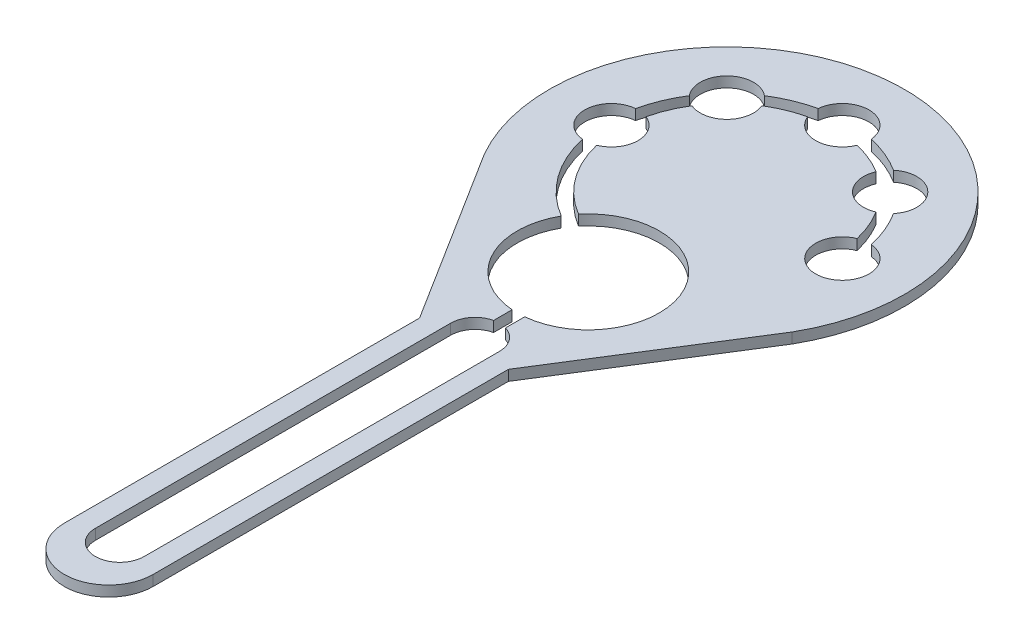
ISO-10303-21;
HEADER;
FILE_DESCRIPTION(('STEP AP214'),'2;1');
FILE_NAME('part.step','',(''),(''),'','','');
FILE_SCHEMA(('AUTOMOTIVE_DESIGN { 1 0 10303 214 1 1 1 1 }'));
ENDSEC;
DATA;
#1=APPLICATION_CONTEXT('core data for automotive mechanical design processes');
#2=APPLICATION_PROTOCOL_DEFINITION('international standard','automotive_design',2000,#1);
#3=PRODUCT_CONTEXT('',#1,'mechanical');
#4=PRODUCT('Part','Part','',(#3));
#5=PRODUCT_RELATED_PRODUCT_CATEGORY('part','',(#4));
#6=PRODUCT_DEFINITION_FORMATION('','',#4);
#7=PRODUCT_DEFINITION_CONTEXT('part definition',#1,'design');
#8=PRODUCT_DEFINITION('design','',#6,#7);
#9=PRODUCT_DEFINITION_SHAPE('','',#8);
#10=(LENGTH_UNIT() NAMED_UNIT(*) SI_UNIT(.MILLI.,.METRE.));
#11=(NAMED_UNIT(*) PLANE_ANGLE_UNIT() SI_UNIT($,.RADIAN.));
#12=(NAMED_UNIT(*) SI_UNIT($,.STERADIAN.) SOLID_ANGLE_UNIT());
#13=UNCERTAINTY_MEASURE_WITH_UNIT(LENGTH_MEASURE(1.E-05),#10,'distance_accuracy_value','');
#14=(GEOMETRIC_REPRESENTATION_CONTEXT(3) GLOBAL_UNCERTAINTY_ASSIGNED_CONTEXT((#13)) GLOBAL_UNIT_ASSIGNED_CONTEXT((#10,
#11,#12)) REPRESENTATION_CONTEXT('',''));
#15=CARTESIAN_POINT('',(0.,0.,0.));
#16=DIRECTION('',(0.,0.,1.));
#17=DIRECTION('',(1.,0.,0.));
#18=AXIS2_PLACEMENT_3D('',#15,#16,#17);
#19=CARTESIAN_POINT('',(0.,0.,39.624));
#20=DIRECTION('',(0.,1.,0.));
#21=DIRECTION('',(0.,0.,1.));
#22=AXIS2_PLACEMENT_3D('',#19,#20,#21);
#23=CYLINDRICAL_SURFACE('',#22,20.32);
#24=CARTESIAN_POINT('',(0.,0.,39.624));
#25=DIRECTION('',(0.,1.,0.));
#26=DIRECTION('',(0.,0.,1.));
#27=AXIS2_PLACEMENT_3D('',#24,#25,#26);
#28=CIRCLE('',#27,20.32);
#29=CARTESIAN_POINT('',(2.03200000000018,0.,59.8421447220065));
#30=VERTEX_POINT('',#29);
#31=CARTESIAN_POINT('',(-15.6958403472736,0.,26.7188461538462));
#32=VERTEX_POINT('',#31);
#33=EDGE_CURVE('E303',#30,#32,#28,.T.);
#34=ORIENTED_EDGE('',*,*,#33,.F.);
#35=DIRECTION('',(0.,1.,0.));
#36=VECTOR('',#35,1.);
#37=CARTESIAN_POINT('',(2.03200000000018,0.,59.8421447220065));
#38=LINE('',#37,#36);
#39=CARTESIAN_POINT('',(2.03200000000018,2.9972,59.8421447220065));
#40=VERTEX_POINT('',#39);
#41=EDGE_CURVE('E281',#30,#40,#38,.T.);
#42=ORIENTED_EDGE('',*,*,#41,.T.);
#43=CARTESIAN_POINT('',(0.,2.9972,39.624));
#44=DIRECTION('',(0.,1.,0.));
#45=DIRECTION('',(0.,0.,1.));
#46=AXIS2_PLACEMENT_3D('',#43,#44,#45);
#47=CIRCLE('',#46,20.32);
#48=CARTESIAN_POINT('',(-15.6958403472736,2.9972,26.7188461538462));
#49=VERTEX_POINT('',#48);
#50=EDGE_CURVE('E270',#40,#49,#47,.T.);
#51=ORIENTED_EDGE('',*,*,#50,.T.);
#52=DIRECTION('',(0.,1.,0.));
#53=VECTOR('',#52,1.);
#54=CARTESIAN_POINT('',(-15.6958403472736,1.4986,26.7188461538462));
#55=LINE('',#54,#53);
#56=EDGE_CURVE('E465',#32,#49,#55,.T.);
#57=ORIENTED_EDGE('',*,*,#56,.F.);
#58=EDGE_LOOP('',(#34,#42,#51,#57));
#59=FACE_BOUND('',#58,.T.);
#60=ADVANCED_FACE('F37',(#59),#23,.F.);
#61=CARTESIAN_POINT('',(0.,0.,72.009));
#62=DIRECTION('',(0.,1.,0.));
#63=DIRECTION('',(0.,0.,1.));
#64=AXIS2_PLACEMENT_3D('',#61,#62,#63);
#65=CYLINDRICAL_SURFACE('',#64,6.985);
#66=CARTESIAN_POINT('',(0.,2.9972,72.009));
#67=DIRECTION('',(0.,1.,0.));
#68=DIRECTION('',(0.,0.,1.));
#69=AXIS2_PLACEMENT_3D('',#66,#67,#68);
#70=CIRCLE('',#69,6.985);
#71=CARTESIAN_POINT('',(6.985,2.9972,72.009));
#72=VERTEX_POINT('',#71);
#73=CARTESIAN_POINT('',(2.03200000000019,2.9972,65.3260963646032));
#74=VERTEX_POINT('',#73);
#75=EDGE_CURVE('E268',#72,#74,#70,.T.);
#76=ORIENTED_EDGE('',*,*,#75,.T.);
#77=DIRECTION('',(0.,1.,0.));
#78=VECTOR('',#77,1.);
#79=CARTESIAN_POINT('',(2.03200000000018,0.,65.3260963646032));
#80=LINE('',#79,#78);
#81=CARTESIAN_POINT('',(2.03200000000018,0.,65.3260963646032));
#82=VERTEX_POINT('',#81);
#83=EDGE_CURVE('E11',#74,#82,#80,.F.);
#84=ORIENTED_EDGE('',*,*,#83,.T.);
#85=CARTESIAN_POINT('',(0.,0.,72.009));
#86=DIRECTION('',(0.,1.,0.));
#87=DIRECTION('',(0.,0.,1.));
#88=AXIS2_PLACEMENT_3D('',#85,#86,#87);
#89=CIRCLE('',#88,6.985);
#90=CARTESIAN_POINT('',(6.985,0.,72.009));
#91=VERTEX_POINT('',#90);
#92=EDGE_CURVE('E485',#91,#82,#89,.T.);
#93=ORIENTED_EDGE('',*,*,#92,.F.);
#94=DIRECTION('',(0.,1.,0.));
#95=VECTOR('',#94,1.);
#96=CARTESIAN_POINT('',(6.985,0.,72.009));
#97=LINE('',#96,#95);
#98=EDGE_CURVE('E273',#91,#72,#97,.T.);
#99=ORIENTED_EDGE('',*,*,#98,.T.);
#100=EDGE_LOOP('',(#76,#84,#93,#99));
#101=FACE_BOUND('',#100,.T.);
#102=ADVANCED_FACE('F272',(#101),#65,.F.);
#103=CARTESIAN_POINT('',(-33.02,0.,0.));
#104=DIRECTION('',(0.,1.,0.));
#105=DIRECTION('',(0.,0.,1.));
#106=AXIS2_PLACEMENT_3D('',#103,#104,#105);
#107=CYLINDRICAL_SURFACE('',#106,7.62);
#108=CARTESIAN_POINT('',(-33.02,0.,0.));
#109=DIRECTION('',(0.,1.,0.));
#110=DIRECTION('',(0.,0.,1.));
#111=AXIS2_PLACEMENT_3D('',#108,#109,#110);
#112=CIRCLE('',#111,7.62);
#113=CARTESIAN_POINT('',(-33.6999384615385,0.,-7.58960365819722));
#114=VERTEX_POINT('',#113);
#115=CARTESIAN_POINT('',(-33.6999384615385,0.,7.58960365819722));
#116=VERTEX_POINT('',#115);
#117=EDGE_CURVE('E403',#114,#116,#112,.T.);
#118=ORIENTED_EDGE('',*,*,#117,.F.);
#119=DIRECTION('',(0.,1.,0.));
#120=VECTOR('',#119,1.);
#121=CARTESIAN_POINT('',(-33.6999384615385,1.4986,-7.58960365819723));
#122=LINE('',#121,#120);
#123=CARTESIAN_POINT('',(-33.6999384615385,2.9972,-7.58960365819722));
#124=VERTEX_POINT('',#123);
#125=EDGE_CURVE('E366',#114,#124,#122,.T.);
#126=ORIENTED_EDGE('',*,*,#125,.T.);
#127=CARTESIAN_POINT('',(-33.02,2.9972,0.));
#128=DIRECTION('',(0.,1.,0.));
#129=DIRECTION('',(0.,0.,1.));
#130=AXIS2_PLACEMENT_3D('',#127,#128,#129);
#131=CIRCLE('',#130,7.62);
#132=CARTESIAN_POINT('',(-33.6999384615385,2.9972,7.58960365819722));
#133=VERTEX_POINT('',#132);
#134=EDGE_CURVE('E407',#124,#133,#131,.T.);
#135=ORIENTED_EDGE('',*,*,#134,.T.);
#136=DIRECTION('',(0.,1.,0.));
#137=VECTOR('',#136,1.);
#138=CARTESIAN_POINT('',(-33.6999384615385,1.4986,7.58960365819723));
#139=LINE('',#138,#137);
#140=EDGE_CURVE('E363',#133,#116,#139,.F.);
#141=ORIENTED_EDGE('',*,*,#140,.T.);
#142=EDGE_LOOP('',(#118,#126,#135,#141));
#143=FACE_BOUND('',#142,.T.);
#144=ADVANCED_FACE('F542',(#143),#107,.F.);
#145=CARTESIAN_POINT('',(23.3486659147799,0.,-23.3486659147797));
#146=DIRECTION('',(0.,1.,0.));
#147=DIRECTION('',(0.,0.,1.));
#148=AXIS2_PLACEMENT_3D('',#145,#146,#147);
#149=CYLINDRICAL_SURFACE('',#148,7.62);
#150=CARTESIAN_POINT('',(23.3486659147799,0.,-23.3486659147797));
#151=DIRECTION('',(0.,1.,0.));
#152=DIRECTION('',(0.,0.,1.));
#153=AXIS2_PLACEMENT_3D('',#150,#151,#152);
#154=CIRCLE('',#153,7.62);
#155=CARTESIAN_POINT('',(29.1961152249528,0.,-18.4627947984936));
#156=VERTEX_POINT('',#155);
#157=CARTESIAN_POINT('',(18.4627947984939,0.,-29.1961152249526));
#158=VERTEX_POINT('',#157);
#159=EDGE_CURVE('E386',#156,#158,#154,.T.);
#160=ORIENTED_EDGE('',*,*,#159,.F.);
#161=DIRECTION('',(0.,1.,0.));
#162=VECTOR('',#161,1.);
#163=CARTESIAN_POINT('',(29.1961152249528,1.4986,-18.4627947984936));
#164=LINE('',#163,#162);
#165=CARTESIAN_POINT('',(29.1961152249528,2.9972,-18.4627947984936));
#166=VERTEX_POINT('',#165);
#167=EDGE_CURVE('E357',#156,#166,#164,.T.);
#168=ORIENTED_EDGE('',*,*,#167,.T.);
#169=CARTESIAN_POINT('',(23.3486659147799,2.9972,-23.3486659147797));
#170=DIRECTION('',(0.,1.,0.));
#171=DIRECTION('',(0.,0.,1.));
#172=AXIS2_PLACEMENT_3D('',#169,#170,#171);
#173=CIRCLE('',#172,7.62);
#174=CARTESIAN_POINT('',(18.4627947984939,2.9972,-29.1961152249526));
#175=VERTEX_POINT('',#174);
#176=EDGE_CURVE('E390',#166,#175,#173,.T.);
#177=ORIENTED_EDGE('',*,*,#176,.T.);
#178=DIRECTION('',(0.,1.,0.));
#179=VECTOR('',#178,1.);
#180=CARTESIAN_POINT('',(18.4627947984939,1.4986,-29.1961152249526));
#181=LINE('',#180,#179);
#182=EDGE_CURVE('E354',#175,#158,#181,.F.);
#183=ORIENTED_EDGE('',*,*,#182,.T.);
#184=EDGE_LOOP('',(#160,#168,#177,#183));
#185=FACE_BOUND('',#184,.T.);
#186=ADVANCED_FACE('F585',(#185),#149,.F.);
#187=CARTESIAN_POINT('',(1.152887138086E-13,0.,-33.02));
#188=DIRECTION('',(0.,1.,0.));
#189=DIRECTION('',(0.,0.,1.));
#190=AXIS2_PLACEMENT_3D('',#187,#188,#189);
#191=CYLINDRICAL_SURFACE('',#190,7.62);
#192=CARTESIAN_POINT('',(1.152887138086E-13,0.,-33.02));
#193=DIRECTION('',(0.,1.,0.));
#194=DIRECTION('',(0.,0.,1.));
#195=AXIS2_PLACEMENT_3D('',#192,#193,#194);
#196=CIRCLE('',#195,7.62);
#197=CARTESIAN_POINT('',(7.58960365819734,0.,-33.6999384615384));
#198=VERTEX_POINT('',#197);
#199=CARTESIAN_POINT('',(-7.5896036581971,0.,-33.6999384615385));
#200=VERTEX_POINT('',#199);
#201=EDGE_CURVE('E378',#198,#200,#196,.T.);
#202=ORIENTED_EDGE('',*,*,#201,.F.);
#203=DIRECTION('',(0.,1.,0.));
#204=VECTOR('',#203,1.);
#205=CARTESIAN_POINT('',(7.58960365819734,1.4986,-33.6999384615384));
#206=LINE('',#205,#204);
#207=CARTESIAN_POINT('',(7.58960365819734,2.9972,-33.6999384615384));
#208=VERTEX_POINT('',#207);
#209=EDGE_CURVE('E351',#198,#208,#206,.T.);
#210=ORIENTED_EDGE('',*,*,#209,.T.);
#211=CARTESIAN_POINT('',(1.152887138086E-13,2.9972,-33.02));
#212=DIRECTION('',(0.,1.,0.));
#213=DIRECTION('',(0.,0.,1.));
#214=AXIS2_PLACEMENT_3D('',#211,#212,#213);
#215=CIRCLE('',#214,7.62);
#216=CARTESIAN_POINT('',(-7.5896036581971,2.9972,-33.6999384615385));
#217=VERTEX_POINT('',#216);
#218=EDGE_CURVE('E382',#208,#217,#215,.T.);
#219=ORIENTED_EDGE('',*,*,#218,.T.);
#220=DIRECTION('',(0.,1.,0.));
#221=VECTOR('',#220,1.);
#222=CARTESIAN_POINT('',(-7.58960365819711,1.4986,-33.6999384615385));
#223=LINE('',#222,#221);
#224=EDGE_CURVE('E348',#217,#200,#223,.F.);
#225=ORIENTED_EDGE('',*,*,#224,.T.);
#226=EDGE_LOOP('',(#202,#210,#219,#225));
#227=FACE_BOUND('',#226,.T.);
#228=ADVANCED_FACE('F556',(#227),#191,.F.);
#229=CARTESIAN_POINT('',(-23.3486659147798,0.,-23.3486659147798));
#230=DIRECTION('',(0.,1.,0.));
#231=DIRECTION('',(0.,0.,1.));
#232=AXIS2_PLACEMENT_3D('',#229,#230,#231);
#233=CYLINDRICAL_SURFACE('',#232,7.62);
#234=CARTESIAN_POINT('',(-23.3486659147798,0.,-23.3486659147798));
#235=DIRECTION('',(0.,1.,0.));
#236=DIRECTION('',(0.,0.,1.));
#237=AXIS2_PLACEMENT_3D('',#234,#235,#236);
#238=CIRCLE('',#237,7.62);
#239=CARTESIAN_POINT('',(-18.4627947984937,0.,-29.1961152249527));
#240=VERTEX_POINT('',#239);
#241=CARTESIAN_POINT('',(-29.1961152249526,0.,-18.4627947984938));
#242=VERTEX_POINT('',#241);
#243=EDGE_CURVE('E373',#240,#242,#238,.T.);
#244=ORIENTED_EDGE('',*,*,#243,.F.);
#245=DIRECTION('',(0.,1.,0.));
#246=VECTOR('',#245,1.);
#247=CARTESIAN_POINT('',(-18.4627947984937,1.4986,-29.1961152249527));
#248=LINE('',#247,#246);
#249=CARTESIAN_POINT('',(-18.4627947984937,2.9972,-29.1961152249527));
#250=VERTEX_POINT('',#249);
#251=EDGE_CURVE('E462',#240,#250,#248,.T.);
#252=ORIENTED_EDGE('',*,*,#251,.T.);
#253=CARTESIAN_POINT('',(-23.3486659147798,2.9972,-23.3486659147798));
#254=DIRECTION('',(0.,1.,0.));
#255=DIRECTION('',(0.,0.,1.));
#256=AXIS2_PLACEMENT_3D('',#253,#254,#255);
#257=CIRCLE('',#256,7.62);
#258=CARTESIAN_POINT('',(-29.1961152249526,2.9972,-18.4627947984938));
#259=VERTEX_POINT('',#258);
#260=EDGE_CURVE('E374',#250,#259,#257,.T.);
#261=ORIENTED_EDGE('',*,*,#260,.T.);
#262=DIRECTION('',(0.,1.,0.));
#263=VECTOR('',#262,1.);
#264=CARTESIAN_POINT('',(-29.1961152249526,1.4986,-18.4627947984938));
#265=LINE('',#264,#263);
#266=EDGE_CURVE('E459',#259,#242,#265,.F.);
#267=ORIENTED_EDGE('',*,*,#266,.T.);
#268=EDGE_LOOP('',(#244,#252,#261,#267));
#269=FACE_BOUND('',#268,.T.);
#270=ADVANCED_FACE('F551',(#269),#233,.F.);
#271=CARTESIAN_POINT('',(-42.9773748278259,2.9972,27.0129462983711));
#272=DIRECTION('',(0.84664900712744,0.,-0.532151725290936));
#273=DIRECTION('',(-0.532151725290936,0.,-0.84664900712744));
#274=AXIS2_PLACEMENT_3D('',#271,#272,#273);
#275=PLANE('',#274);
#276=DIRECTION('',(0.532151725290936,0.,0.84664900712744));
#277=VECTOR('',#276,1.);
#278=CARTESIAN_POINT('',(-42.9773748278259,0.,27.0129462983711));
#279=LINE('',#278,#277);
#280=CARTESIAN_POINT('',(-44.0264003273322,0.,25.3439553783045));
#281=VERTEX_POINT('',#280);
#282=CARTESIAN_POINT('',(-12.7,0.,75.184));
#283=VERTEX_POINT('',#282);
#284=EDGE_CURVE('E402',#281,#283,#279,.T.);
#285=ORIENTED_EDGE('',*,*,#284,.T.);
#286=DIRECTION('',(0.,-1.,0.));
#287=VECTOR('',#286,1.);
#288=CARTESIAN_POINT('',(-12.7,2.9972,75.184));
#289=LINE('',#288,#287);
#290=CARTESIAN_POINT('',(-12.7,2.9972,75.184));
#291=VERTEX_POINT('',#290);
#292=EDGE_CURVE('E450',#291,#283,#289,.T.);
#293=ORIENTED_EDGE('',*,*,#292,.F.);
#294=DIRECTION('',(0.532151725290936,0.,0.84664900712744));
#295=VECTOR('',#294,1.);
#296=CARTESIAN_POINT('',(-42.9773748278259,2.9972,27.0129462983711));
#297=LINE('',#296,#295);
#298=CARTESIAN_POINT('',(-44.0264003273322,2.9972,25.3439553783045));
#299=VERTEX_POINT('',#298);
#300=EDGE_CURVE('E408',#299,#291,#297,.T.);
#301=ORIENTED_EDGE('',*,*,#300,.F.);
#302=DIRECTION('',(0.,-1.,0.));
#303=VECTOR('',#302,1.);
#304=CARTESIAN_POINT('',(-44.0264003273322,2.9972,25.3439553783045));
#305=LINE('',#304,#303);
#306=EDGE_CURVE('E424',#299,#281,#305,.T.);
#307=ORIENTED_EDGE('',*,*,#306,.T.);
#308=EDGE_LOOP('',(#285,#293,#301,#307));
#309=FACE_BOUND('',#308,.T.);
#310=ADVANCED_FACE('F39',(#309),#275,.F.);
#311=CARTESIAN_POINT('',(-12.7,2.9972,0.));
#312=DIRECTION('',(1.,0.,0.));
#313=DIRECTION('',(0.,0.,-1.));
#314=AXIS2_PLACEMENT_3D('',#311,#312,#313);
#315=PLANE('',#314);
#316=DIRECTION('',(0.,0.,1.));
#317=VECTOR('',#316,1.);
#318=CARTESIAN_POINT('',(-12.7,0.,0.));
#319=LINE('',#318,#317);
#320=CARTESIAN_POINT('',(-12.7,0.,176.784));
#321=VERTEX_POINT('',#320);
#322=EDGE_CURVE('E427',#283,#321,#319,.T.);
#323=ORIENTED_EDGE('',*,*,#322,.T.);
#324=DIRECTION('',(0.,-1.,0.));
#325=VECTOR('',#324,1.);
#326=CARTESIAN_POINT('',(-12.7,2.9972,176.784));
#327=LINE('',#326,#325);
#328=CARTESIAN_POINT('',(-12.7,2.9972,176.784));
#329=VERTEX_POINT('',#328);
#330=EDGE_CURVE('E447',#329,#321,#327,.T.);
#331=ORIENTED_EDGE('',*,*,#330,.F.);
#332=DIRECTION('',(0.,0.,1.));
#333=VECTOR('',#332,1.);
#334=CARTESIAN_POINT('',(-12.7,2.9972,0.));
#335=LINE('',#334,#333);
#336=EDGE_CURVE('E411',#291,#329,#335,.T.);
#337=ORIENTED_EDGE('',*,*,#336,.F.);
#338=ORIENTED_EDGE('',*,*,#292,.T.);
#339=EDGE_LOOP('',(#323,#331,#337,#338));
#340=FACE_BOUND('',#339,.T.);
#341=ADVANCED_FACE('F866',(#340),#315,.F.);
#342=CARTESIAN_POINT('',(0.,2.9972,176.784));
#343=DIRECTION('',(0.,-1.,0.));
#344=DIRECTION('',(0.,0.,-1.));
#345=AXIS2_PLACEMENT_3D('',#342,#343,#344);
#346=CYLINDRICAL_SURFACE('',#345,12.7);
#347=CARTESIAN_POINT('',(0.,0.,176.784));
#348=DIRECTION('',(0.,1.,0.));
#349=DIRECTION('',(0.,0.,1.));
#350=AXIS2_PLACEMENT_3D('',#347,#348,#349);
#351=CIRCLE('',#350,12.7);
#352=CARTESIAN_POINT('',(12.7,0.,176.784));
#353=VERTEX_POINT('',#352);
#354=EDGE_CURVE('E429',#321,#353,#351,.T.);
#355=ORIENTED_EDGE('',*,*,#354,.T.);
#356=DIRECTION('',(0.,-1.,0.));
#357=VECTOR('',#356,1.);
#358=CARTESIAN_POINT('',(12.7,2.9972,176.784));
#359=LINE('',#358,#357);
#360=CARTESIAN_POINT('',(12.7,2.9972,176.784));
#361=VERTEX_POINT('',#360);
#362=EDGE_CURVE('E445',#361,#353,#359,.T.);
#363=ORIENTED_EDGE('',*,*,#362,.F.);
#364=CARTESIAN_POINT('',(0.,2.9972,176.784));
#365=DIRECTION('',(0.,1.,0.));
#366=DIRECTION('',(0.,0.,1.));
#367=AXIS2_PLACEMENT_3D('',#364,#365,#366);
#368=CIRCLE('',#367,12.7);
#369=EDGE_CURVE('E414',#329,#361,#368,.T.);
#370=ORIENTED_EDGE('',*,*,#369,.F.);
#371=ORIENTED_EDGE('',*,*,#330,.T.);
#372=EDGE_LOOP('',(#355,#363,#370,#371));
#373=FACE_BOUND('',#372,.T.);
#374=ADVANCED_FACE('F856',(#373),#346,.T.);
#375=CARTESIAN_POINT('',(12.7,2.9972,0.));
#376=DIRECTION('',(1.,0.,0.));
#377=DIRECTION('',(0.,0.,-1.));
#378=AXIS2_PLACEMENT_3D('',#375,#376,#377);
#379=PLANE('',#378);
#380=DIRECTION('',(0.,0.,1.));
#381=VECTOR('',#380,1.);
#382=CARTESIAN_POINT('',(12.7,0.,0.));
#383=LINE('',#382,#381);
#384=CARTESIAN_POINT('',(12.7,0.,75.184));
#385=VERTEX_POINT('',#384);
#386=EDGE_CURVE('E432',#385,#353,#383,.T.);
#387=ORIENTED_EDGE('',*,*,#386,.F.);
#388=DIRECTION('',(0.,-1.,0.));
#389=VECTOR('',#388,1.);
#390=CARTESIAN_POINT('',(12.7,2.9972,75.184));
#391=LINE('',#390,#389);
#392=CARTESIAN_POINT('',(12.7,2.9972,75.184));
#393=VERTEX_POINT('',#392);
#394=EDGE_CURVE('E443',#393,#385,#391,.T.);
#395=ORIENTED_EDGE('',*,*,#394,.F.);
#396=DIRECTION('',(0.,0.,1.));
#397=VECTOR('',#396,1.);
#398=CARTESIAN_POINT('',(12.7,2.9972,0.));
#399=LINE('',#398,#397);
#400=EDGE_CURVE('E416',#393,#361,#399,.T.);
#401=ORIENTED_EDGE('',*,*,#400,.T.);
#402=ORIENTED_EDGE('',*,*,#362,.T.);
#403=EDGE_LOOP('',(#387,#395,#401,#402));
#404=FACE_BOUND('',#403,.T.);
#405=ADVANCED_FACE('F846',(#404),#379,.T.);
#406=CARTESIAN_POINT('',(42.9773748278259,2.9972,27.0129462983711));
#407=DIRECTION('',(0.846649007127441,0.,0.532151725290935));
#408=DIRECTION('',(0.532151725290935,0.,-0.846649007127441));
#409=AXIS2_PLACEMENT_3D('',#406,#407,#408);
#410=PLANE('',#409);
#411=DIRECTION('',(-0.532151725290935,0.,0.846649007127441));
#412=VECTOR('',#411,1.);
#413=CARTESIAN_POINT('',(42.9773748278259,0.,27.0129462983711));
#414=LINE('',#413,#412);
#415=CARTESIAN_POINT('',(44.0264003273321,0.,25.3439553783044));
#416=VERTEX_POINT('',#415);
#417=EDGE_CURVE('E435',#416,#385,#414,.T.);
#418=ORIENTED_EDGE('',*,*,#417,.F.);
#419=DIRECTION('',(0.,-1.,0.));
#420=VECTOR('',#419,1.);
#421=CARTESIAN_POINT('',(44.0264003273321,2.9972,25.3439553783044));
#422=LINE('',#421,#420);
#423=CARTESIAN_POINT('',(44.0264003273321,2.9972,25.3439553783044));
#424=VERTEX_POINT('',#423);
#425=EDGE_CURVE('E441',#424,#416,#422,.T.);
#426=ORIENTED_EDGE('',*,*,#425,.F.);
#427=DIRECTION('',(-0.532151725290935,0.,0.846649007127441));
#428=VECTOR('',#427,1.);
#429=CARTESIAN_POINT('',(42.9773748278259,2.9972,27.0129462983711));
#430=LINE('',#429,#428);
#431=EDGE_CURVE('E419',#424,#393,#430,.T.);
#432=ORIENTED_EDGE('',*,*,#431,.T.);
#433=ORIENTED_EDGE('',*,*,#394,.T.);
#434=EDGE_LOOP('',(#418,#426,#432,#433));
#435=FACE_BOUND('',#434,.T.);
#436=ADVANCED_FACE('F836',(#435),#410,.T.);
#437=CARTESIAN_POINT('',(0.,2.9972,0.));
#438=DIRECTION('',(0.,-1.,0.));
#439=DIRECTION('',(0.,0.,-1.));
#440=AXIS2_PLACEMENT_3D('',#437,#438,#439);
#441=CYLINDRICAL_SURFACE('',#440,50.8);
#442=CARTESIAN_POINT('',(0.,0.,0.));
#443=DIRECTION('',(0.,1.,0.));
#444=DIRECTION('',(0.,0.,1.));
#445=AXIS2_PLACEMENT_3D('',#442,#443,#444);
#446=CIRCLE('',#445,50.8);
#447=EDGE_CURVE('E412',#416,#281,#446,.T.);
#448=ORIENTED_EDGE('',*,*,#447,.T.);
#449=ORIENTED_EDGE('',*,*,#306,.F.);
#450=CARTESIAN_POINT('',(0.,2.9972,0.));
#451=DIRECTION('',(0.,1.,0.));
#452=DIRECTION('',(0.,0.,1.));
#453=AXIS2_PLACEMENT_3D('',#450,#451,#452);
#454=CIRCLE('',#453,50.8);
#455=EDGE_CURVE('E422',#424,#299,#454,.T.);
#456=ORIENTED_EDGE('',*,*,#455,.F.);
#457=ORIENTED_EDGE('',*,*,#425,.T.);
#458=EDGE_LOOP('',(#448,#449,#456,#457));
#459=FACE_BOUND('',#458,.T.);
#460=ADVANCED_FACE('F659',(#459),#441,.T.);
#461=CARTESIAN_POINT('',(0.,2.9972,0.));
#462=DIRECTION('',(0.,1.,0.));
#463=DIRECTION('',(0.,0.,1.));
#464=AXIS2_PLACEMENT_3D('',#461,#462,#463);
#465=PLANE('',#464);
#466=DIRECTION('',(0.,0.,-1.));
#467=VECTOR('',#466,1.);
#468=CARTESIAN_POINT('',(2.03200000000018,2.9972,57.5600150428634));
#469=LINE('',#468,#467);
#470=EDGE_CURVE('E256',#74,#40,#469,.T.);
#471=ORIENTED_EDGE('',*,*,#470,.F.);
#472=ORIENTED_EDGE('',*,*,#75,.F.);
#473=DIRECTION('',(0.,0.,-1.));
#474=VECTOR('',#473,1.);
#475=CARTESIAN_POINT('',(6.985,2.9972,72.009));
#476=LINE('',#475,#474);
#477=CARTESIAN_POINT('',(6.98500000000001,2.9972,173.609));
#478=VERTEX_POINT('',#477);
#479=EDGE_CURVE('E288',#478,#72,#476,.T.);
#480=ORIENTED_EDGE('',*,*,#479,.F.);
#481=CARTESIAN_POINT('',(0.,2.9972,173.609));
#482=DIRECTION('',(0.,1.,0.));
#483=DIRECTION('',(0.,0.,1.));
#484=AXIS2_PLACEMENT_3D('',#481,#482,#483);
#485=CIRCLE('',#484,6.985);
#486=CARTESIAN_POINT('',(-6.98499999999999,2.9972,173.609));
#487=VERTEX_POINT('',#486);
#488=EDGE_CURVE('E279',#487,#478,#485,.T.);
#489=ORIENTED_EDGE('',*,*,#488,.F.);
#490=DIRECTION('',(0.,0.,1.));
#491=VECTOR('',#490,1.);
#492=CARTESIAN_POINT('',(-6.985,2.9972,72.009));
#493=LINE('',#492,#491);
#494=CARTESIAN_POINT('',(-6.985,2.9972,72.009));
#495=VERTEX_POINT('',#494);
#496=EDGE_CURVE('E275',#495,#487,#493,.T.);
#497=ORIENTED_EDGE('',*,*,#496,.F.);
#498=CARTESIAN_POINT('',(-1.52399999999982,2.9972,65.1922816546376));
#499=VERTEX_POINT('',#498);
#500=EDGE_CURVE('E276',#499,#495,#70,.T.);
#501=ORIENTED_EDGE('',*,*,#500,.F.);
#502=DIRECTION('',(0.,0.,1.));
#503=VECTOR('',#502,1.);
#504=CARTESIAN_POINT('',(-1.52399999999982,2.9972,57.5600150428634));
#505=LINE('',#504,#503);
#506=CARTESIAN_POINT('',(-1.52399999999982,2.9972,59.886769405982));
#507=VERTEX_POINT('',#506);
#508=EDGE_CURVE('E59',#507,#499,#505,.T.);
#509=ORIENTED_EDGE('',*,*,#508,.F.);
#510=CARTESIAN_POINT('',(-17.7090044959248,2.9972,29.6593846153846));
#511=VERTEX_POINT('',#510);
#512=EDGE_CURVE('E304',#511,#507,#47,.T.);
#513=ORIENTED_EDGE('',*,*,#512,.F.);
#514=CARTESIAN_POINT('',(0.,2.9972,0.));
#515=DIRECTION('',(0.,1.,0.));
#516=DIRECTION('',(0.,0.,-1.));
#517=AXIS2_PLACEMENT_3D('',#514,#515,#516);
#518=CIRCLE('',#517,34.544);
#519=EDGE_CURVE('E309',#133,#511,#518,.T.);
#520=ORIENTED_EDGE('',*,*,#519,.F.);
#521=ORIENTED_EDGE('',*,*,#134,.F.);
#522=EDGE_CURVE('E323',#259,#124,#518,.T.);
#523=ORIENTED_EDGE('',*,*,#522,.F.);
#524=ORIENTED_EDGE('',*,*,#260,.F.);
#525=EDGE_CURVE('E527',#217,#250,#518,.T.);
#526=ORIENTED_EDGE('',*,*,#525,.F.);
#527=ORIENTED_EDGE('',*,*,#218,.F.);
#528=EDGE_CURVE('E524',#175,#208,#518,.T.);
#529=ORIENTED_EDGE('',*,*,#528,.F.);
#530=ORIENTED_EDGE('',*,*,#176,.F.);
#531=CARTESIAN_POINT('',(33.6999384615385,2.9972,-7.58960365819699));
#532=VERTEX_POINT('',#531);
#533=EDGE_CURVE('E324',#532,#166,#518,.T.);
#534=ORIENTED_EDGE('',*,*,#533,.F.);
#535=CARTESIAN_POINT('',(33.02,2.9972,2.30577427617201E-13));
#536=DIRECTION('',(0.,1.,0.));
#537=DIRECTION('',(0.,0.,1.));
#538=AXIS2_PLACEMENT_3D('',#535,#536,#537);
#539=CIRCLE('',#538,7.62);
#540=CARTESIAN_POINT('',(30.1712923076924,2.9972,-7.06747935856795));
#541=VERTEX_POINT('',#540);
#542=EDGE_CURVE('E369',#541,#532,#539,.T.);
#543=ORIENTED_EDGE('',*,*,#542,.F.);
#544=CARTESIAN_POINT('',(0.,2.9972,0.));
#545=DIRECTION('',(0.,-1.,0.));
#546=DIRECTION('',(0.,0.,-1.));
#547=AXIS2_PLACEMENT_3D('',#544,#545,#546);
#548=CIRCLE('',#547,30.988);
#549=CARTESIAN_POINT('',(26.3317879682703,2.9972,-16.3368628075911));
#550=VERTEX_POINT('',#549);
#551=EDGE_CURVE('E327',#550,#541,#548,.T.);
#552=ORIENTED_EDGE('',*,*,#551,.F.);
#553=CARTESIAN_POINT('',(16.3368628075914,2.9972,-26.3317879682702));
#554=VERTEX_POINT('',#553);
#555=EDGE_CURVE('E391',#554,#550,#173,.T.);
#556=ORIENTED_EDGE('',*,*,#555,.F.);
#557=CARTESIAN_POINT('',(7.06747935856827,2.9972,-30.1712923076923));
#558=VERTEX_POINT('',#557);
#559=EDGE_CURVE('E518',#558,#554,#548,.T.);
#560=ORIENTED_EDGE('',*,*,#559,.F.);
#561=CARTESIAN_POINT('',(-7.06747935856806,2.9972,-30.1712923076923));
#562=VERTEX_POINT('',#561);
#563=EDGE_CURVE('E383',#562,#558,#215,.T.);
#564=ORIENTED_EDGE('',*,*,#563,.F.);
#565=CARTESIAN_POINT('',(-16.3368628075912,2.9972,-26.3317879682703));
#566=VERTEX_POINT('',#565);
#567=EDGE_CURVE('E517',#566,#562,#548,.T.);
#568=ORIENTED_EDGE('',*,*,#567,.F.);
#569=CARTESIAN_POINT('',(-26.3317879682702,2.9972,-16.3368628075913));
#570=VERTEX_POINT('',#569);
#571=EDGE_CURVE('E375',#570,#566,#257,.T.);
#572=ORIENTED_EDGE('',*,*,#571,.F.);
#573=CARTESIAN_POINT('',(-30.1712923076923,2.9972,-7.06747935856816));
#574=VERTEX_POINT('',#573);
#575=EDGE_CURVE('E326',#574,#570,#548,.T.);
#576=ORIENTED_EDGE('',*,*,#575,.F.);
#577=CARTESIAN_POINT('',(-30.1712923076923,2.9972,7.06747935856816));
#578=VERTEX_POINT('',#577);
#579=EDGE_CURVE('E404',#578,#574,#131,.T.);
#580=ORIENTED_EDGE('',*,*,#579,.F.);
#581=EDGE_CURVE('E314',#49,#578,#548,.T.);
#582=ORIENTED_EDGE('',*,*,#581,.F.);
#583=ORIENTED_EDGE('',*,*,#50,.F.);
#584=EDGE_LOOP('',(#471,#472,#480,#489,#497,#501,#509,#513,#520,#521,#523,#524,#526,#527,#529,
#530,#534,#543,#552,#556,#560,#564,#568,#572,#576,#580,#582,#583));
#585=FACE_BOUND('',#584,.T.);
#586=ORIENTED_EDGE('',*,*,#300,.T.);
#587=ORIENTED_EDGE('',*,*,#336,.T.);
#588=ORIENTED_EDGE('',*,*,#369,.T.);
#589=ORIENTED_EDGE('',*,*,#400,.F.);
#590=ORIENTED_EDGE('',*,*,#431,.F.);
#591=ORIENTED_EDGE('',*,*,#455,.T.);
#592=EDGE_LOOP('',(#586,#587,#588,#589,#590,#591));
#593=FACE_BOUND('',#592,.T.);
#594=ADVANCED_FACE('F265',(#585,#593),#465,.T.);
#595=CARTESIAN_POINT('',(0.,0.,0.));
#596=DIRECTION('',(0.,1.,0.));
#597=DIRECTION('',(0.,0.,1.));
#598=AXIS2_PLACEMENT_3D('',#595,#596,#597);
#599=PLANE('',#598);
#600=ORIENTED_EDGE('',*,*,#92,.T.);
#601=DIRECTION('',(0.,0.,-1.));
#602=VECTOR('',#601,1.);
#603=CARTESIAN_POINT('',(2.03200000000018,0.,57.5600150428634));
#604=LINE('',#603,#602);
#605=EDGE_CURVE('E52',#82,#30,#604,.T.);
#606=ORIENTED_EDGE('',*,*,#605,.T.);
#607=ORIENTED_EDGE('',*,*,#33,.T.);
#608=CARTESIAN_POINT('',(0.,0.,0.));
#609=DIRECTION('',(0.,-1.,0.));
#610=DIRECTION('',(0.,0.,-1.));
#611=AXIS2_PLACEMENT_3D('',#608,#609,#610);
#612=CIRCLE('',#611,30.988);
#613=CARTESIAN_POINT('',(-30.1712923076923,0.,7.06747935856816));
#614=VERTEX_POINT('',#613);
#615=EDGE_CURVE('E316',#32,#614,#612,.T.);
#616=ORIENTED_EDGE('',*,*,#615,.T.);
#617=CARTESIAN_POINT('',(-30.1712923076923,0.,-7.06747935856816));
#618=VERTEX_POINT('',#617);
#619=EDGE_CURVE('E399',#614,#618,#112,.T.);
#620=ORIENTED_EDGE('',*,*,#619,.T.);
#621=CARTESIAN_POINT('',(-26.3317879682702,0.,-16.3368628075913));
#622=VERTEX_POINT('',#621);
#623=EDGE_CURVE('E319',#618,#622,#612,.T.);
#624=ORIENTED_EDGE('',*,*,#623,.T.);
#625=CARTESIAN_POINT('',(-16.3368628075912,0.,-26.3317879682703));
#626=VERTEX_POINT('',#625);
#627=EDGE_CURVE('E370',#622,#626,#238,.T.);
#628=ORIENTED_EDGE('',*,*,#627,.T.);
#629=CARTESIAN_POINT('',(-7.06747935856806,0.,-30.1712923076923));
#630=VERTEX_POINT('',#629);
#631=EDGE_CURVE('E567',#626,#630,#612,.T.);
#632=ORIENTED_EDGE('',*,*,#631,.T.);
#633=CARTESIAN_POINT('',(7.06747935856827,0.,-30.1712923076923));
#634=VERTEX_POINT('',#633);
#635=EDGE_CURVE('E379',#630,#634,#196,.T.);
#636=ORIENTED_EDGE('',*,*,#635,.T.);
#637=CARTESIAN_POINT('',(16.3368628075914,0.,-26.3317879682702));
#638=VERTEX_POINT('',#637);
#639=EDGE_CURVE('E564',#634,#638,#612,.T.);
#640=ORIENTED_EDGE('',*,*,#639,.T.);
#641=CARTESIAN_POINT('',(26.3317879682703,0.,-16.3368628075911));
#642=VERTEX_POINT('',#641);
#643=EDGE_CURVE('E387',#638,#642,#154,.T.);
#644=ORIENTED_EDGE('',*,*,#643,.T.);
#645=CARTESIAN_POINT('',(30.1712923076924,0.,-7.06747935856795));
#646=VERTEX_POINT('',#645);
#647=EDGE_CURVE('E320',#642,#646,#612,.T.);
#648=ORIENTED_EDGE('',*,*,#647,.T.);
#649=CARTESIAN_POINT('',(33.02,0.,2.30577427617201E-13));
#650=DIRECTION('',(0.,1.,0.));
#651=DIRECTION('',(0.,0.,1.));
#652=AXIS2_PLACEMENT_3D('',#649,#650,#651);
#653=CIRCLE('',#652,7.62);
#654=CARTESIAN_POINT('',(33.6999384615385,0.,-7.58960365819699));
#655=VERTEX_POINT('',#654);
#656=EDGE_CURVE('E394',#646,#655,#653,.T.);
#657=ORIENTED_EDGE('',*,*,#656,.T.);
#658=CARTESIAN_POINT('',(0.,0.,0.));
#659=DIRECTION('',(0.,1.,0.));
#660=DIRECTION('',(0.,0.,-1.));
#661=AXIS2_PLACEMENT_3D('',#658,#659,#660);
#662=CIRCLE('',#661,34.544);
#663=EDGE_CURVE('E315',#655,#156,#662,.T.);
#664=ORIENTED_EDGE('',*,*,#663,.T.);
#665=ORIENTED_EDGE('',*,*,#159,.T.);
#666=EDGE_CURVE('E559',#158,#198,#662,.T.);
#667=ORIENTED_EDGE('',*,*,#666,.T.);
#668=ORIENTED_EDGE('',*,*,#201,.T.);
#669=EDGE_CURVE('E549',#200,#240,#662,.T.);
#670=ORIENTED_EDGE('',*,*,#669,.T.);
#671=ORIENTED_EDGE('',*,*,#243,.T.);
#672=EDGE_CURVE('E313',#242,#114,#662,.T.);
#673=ORIENTED_EDGE('',*,*,#672,.T.);
#674=ORIENTED_EDGE('',*,*,#117,.T.);
#675=CARTESIAN_POINT('',(-17.7090044959248,0.,29.6593846153846));
#676=VERTEX_POINT('',#675);
#677=EDGE_CURVE('E310',#116,#676,#662,.T.);
#678=ORIENTED_EDGE('',*,*,#677,.T.);
#679=CARTESIAN_POINT('',(-1.52399999999982,0.,59.886769405982));
#680=VERTEX_POINT('',#679);
#681=EDGE_CURVE('E299',#676,#680,#28,.T.);
#682=ORIENTED_EDGE('',*,*,#681,.T.);
#683=DIRECTION('',(0.,0.,1.));
#684=VECTOR('',#683,1.);
#685=CARTESIAN_POINT('',(-1.52399999999982,0.,57.5600150428634));
#686=LINE('',#685,#684);
#687=CARTESIAN_POINT('',(-1.52399999999982,0.,65.1922816546376));
#688=VERTEX_POINT('',#687);
#689=EDGE_CURVE('E493',#680,#688,#686,.T.);
#690=ORIENTED_EDGE('',*,*,#689,.T.);
#691=CARTESIAN_POINT('',(-6.985,0.,72.009));
#692=VERTEX_POINT('',#691);
#693=EDGE_CURVE('E290',#688,#692,#89,.T.);
#694=ORIENTED_EDGE('',*,*,#693,.T.);
#695=DIRECTION('',(0.,0.,1.));
#696=VECTOR('',#695,1.);
#697=CARTESIAN_POINT('',(-6.985,0.,72.009));
#698=LINE('',#697,#696);
#699=CARTESIAN_POINT('',(-6.98499999999999,0.,173.609));
#700=VERTEX_POINT('',#699);
#701=EDGE_CURVE('E481',#692,#700,#698,.T.);
#702=ORIENTED_EDGE('',*,*,#701,.T.);
#703=CARTESIAN_POINT('',(0.,0.,173.609));
#704=DIRECTION('',(0.,1.,0.));
#705=DIRECTION('',(0.,0.,1.));
#706=AXIS2_PLACEMENT_3D('',#703,#704,#705);
#707=CIRCLE('',#706,6.985);
#708=CARTESIAN_POINT('',(6.98500000000001,0.,173.609));
#709=VERTEX_POINT('',#708);
#710=EDGE_CURVE('E484',#700,#709,#707,.T.);
#711=ORIENTED_EDGE('',*,*,#710,.T.);
#712=DIRECTION('',(0.,0.,-1.));
#713=VECTOR('',#712,1.);
#714=CARTESIAN_POINT('',(6.985,0.,72.009));
#715=LINE('',#714,#713);
#716=EDGE_CURVE('E283',#709,#91,#715,.T.);
#717=ORIENTED_EDGE('',*,*,#716,.T.);
#718=EDGE_LOOP('',(#600,#606,#607,#616,#620,#624,#628,#632,#636,#640,#644,#648,#657,#664,#665,
#667,#668,#670,#671,#673,#674,#678,#682,#690,#694,#702,#711,#717));
#719=FACE_BOUND('',#718,.T.);
#720=ORIENTED_EDGE('',*,*,#284,.F.);
#721=ORIENTED_EDGE('',*,*,#447,.F.);
#722=ORIENTED_EDGE('',*,*,#417,.T.);
#723=ORIENTED_EDGE('',*,*,#386,.T.);
#724=ORIENTED_EDGE('',*,*,#354,.F.);
#725=ORIENTED_EDGE('',*,*,#322,.F.);
#726=EDGE_LOOP('',(#720,#721,#722,#723,#724,#725));
#727=FACE_BOUND('',#726,.T.);
#728=ADVANCED_FACE('F497',(#719,#727),#599,.F.);
#729=ORIENTED_EDGE('',*,*,#579,.T.);
#730=DIRECTION('',(0.,1.,0.));
#731=VECTOR('',#730,1.);
#732=CARTESIAN_POINT('',(-30.1712923076923,1.4986,-7.06747935856816));
#733=LINE('',#732,#731);
#734=EDGE_CURVE('E345',#574,#618,#733,.F.);
#735=ORIENTED_EDGE('',*,*,#734,.T.);
#736=ORIENTED_EDGE('',*,*,#619,.F.);
#737=DIRECTION('',(0.,1.,0.));
#738=VECTOR('',#737,1.);
#739=CARTESIAN_POINT('',(-30.1712923076923,1.4986,7.06747935856816));
#740=LINE('',#739,#738);
#741=EDGE_CURVE('E342',#614,#578,#740,.T.);
#742=ORIENTED_EDGE('',*,*,#741,.T.);
#743=EDGE_LOOP('',(#729,#735,#736,#742));
#744=FACE_BOUND('',#743,.T.);
#745=ADVANCED_FACE('F510',(#744),#107,.F.);
#746=CARTESIAN_POINT('',(33.02,0.,2.30577427617201E-13));
#747=DIRECTION('',(0.,1.,0.));
#748=DIRECTION('',(0.,0.,1.));
#749=AXIS2_PLACEMENT_3D('',#746,#747,#748);
#750=CYLINDRICAL_SURFACE('',#749,7.62);
#751=ORIENTED_EDGE('',*,*,#542,.T.);
#752=DIRECTION('',(0.,1.,0.));
#753=VECTOR('',#752,1.);
#754=CARTESIAN_POINT('',(33.6999384615385,1.4986,-7.58960365819699));
#755=LINE('',#754,#753);
#756=EDGE_CURVE('E360',#532,#655,#755,.F.);
#757=ORIENTED_EDGE('',*,*,#756,.T.);
#758=ORIENTED_EDGE('',*,*,#656,.F.);
#759=DIRECTION('',(0.,1.,0.));
#760=VECTOR('',#759,1.);
#761=CARTESIAN_POINT('',(30.1712923076924,1.4986,-7.06747935856795));
#762=LINE('',#761,#760);
#763=EDGE_CURVE('E339',#646,#541,#762,.T.);
#764=ORIENTED_EDGE('',*,*,#763,.T.);
#765=EDGE_LOOP('',(#751,#757,#758,#764));
#766=FACE_BOUND('',#765,.T.);
#767=ADVANCED_FACE('F581',(#766),#750,.F.);
#768=ORIENTED_EDGE('',*,*,#555,.T.);
#769=DIRECTION('',(0.,1.,0.));
#770=VECTOR('',#769,1.);
#771=CARTESIAN_POINT('',(26.3317879682703,1.4986,-16.3368628075911));
#772=LINE('',#771,#770);
#773=EDGE_CURVE('E336',#550,#642,#772,.F.);
#774=ORIENTED_EDGE('',*,*,#773,.T.);
#775=ORIENTED_EDGE('',*,*,#643,.F.);
#776=DIRECTION('',(0.,1.,0.));
#777=VECTOR('',#776,1.);
#778=CARTESIAN_POINT('',(16.3368628075914,1.4986,-26.3317879682702));
#779=LINE('',#778,#777);
#780=EDGE_CURVE('E333',#638,#554,#779,.T.);
#781=ORIENTED_EDGE('',*,*,#780,.T.);
#782=EDGE_LOOP('',(#768,#774,#775,#781));
#783=FACE_BOUND('',#782,.T.);
#784=ADVANCED_FACE('F578',(#783),#149,.F.);
#785=ORIENTED_EDGE('',*,*,#563,.T.);
#786=DIRECTION('',(0.,1.,0.));
#787=VECTOR('',#786,1.);
#788=CARTESIAN_POINT('',(7.06747935856827,1.4986,-30.1712923076923));
#789=LINE('',#788,#787);
#790=EDGE_CURVE('E330',#558,#634,#789,.F.);
#791=ORIENTED_EDGE('',*,*,#790,.T.);
#792=ORIENTED_EDGE('',*,*,#635,.F.);
#793=DIRECTION('',(0.,1.,0.));
#794=VECTOR('',#793,1.);
#795=CARTESIAN_POINT('',(-7.06747935856805,1.4986,-30.1712923076923));
#796=LINE('',#795,#794);
#797=EDGE_CURVE('E318',#630,#562,#796,.T.);
#798=ORIENTED_EDGE('',*,*,#797,.T.);
#799=EDGE_LOOP('',(#785,#791,#792,#798));
#800=FACE_BOUND('',#799,.T.);
#801=ADVANCED_FACE('F572',(#800),#191,.F.);
#802=ORIENTED_EDGE('',*,*,#571,.T.);
#803=DIRECTION('',(0.,1.,0.));
#804=VECTOR('',#803,1.);
#805=CARTESIAN_POINT('',(-16.3368628075912,1.4986,-26.3317879682703));
#806=LINE('',#805,#804);
#807=EDGE_CURVE('E456',#566,#626,#806,.F.);
#808=ORIENTED_EDGE('',*,*,#807,.T.);
#809=ORIENTED_EDGE('',*,*,#627,.F.);
#810=DIRECTION('',(0.,1.,0.));
#811=VECTOR('',#810,1.);
#812=CARTESIAN_POINT('',(-26.3317879682702,1.4986,-16.3368628075913));
#813=LINE('',#812,#811);
#814=EDGE_CURVE('E453',#622,#570,#813,.T.);
#815=ORIENTED_EDGE('',*,*,#814,.T.);
#816=EDGE_LOOP('',(#802,#808,#809,#815));
#817=FACE_BOUND('',#816,.T.);
#818=ADVANCED_FACE('F763',(#817),#233,.F.);
#819=CARTESIAN_POINT('',(0.,0.,0.));
#820=DIRECTION('',(0.,1.,0.));
#821=DIRECTION('',(0.,0.,1.));
#822=AXIS2_PLACEMENT_3D('',#819,#820,#821);
#823=CYLINDRICAL_SURFACE('',#822,30.988);
#824=ORIENTED_EDGE('',*,*,#575,.T.);
#825=ORIENTED_EDGE('',*,*,#814,.F.);
#826=ORIENTED_EDGE('',*,*,#623,.F.);
#827=ORIENTED_EDGE('',*,*,#734,.F.);
#828=EDGE_LOOP('',(#824,#825,#826,#827));
#829=FACE_BOUND('',#828,.T.);
#830=ADVANCED_FACE('F514',(#829),#823,.T.);
#831=ORIENTED_EDGE('',*,*,#631,.F.);
#832=ORIENTED_EDGE('',*,*,#807,.F.);
#833=ORIENTED_EDGE('',*,*,#567,.T.);
#834=ORIENTED_EDGE('',*,*,#797,.F.);
#835=EDGE_LOOP('',(#831,#832,#833,#834));
#836=FACE_BOUND('',#835,.T.);
#837=ADVANCED_FACE('F734',(#836),#823,.T.);
#838=CARTESIAN_POINT('',(0.,0.,0.));
#839=DIRECTION('',(0.,1.,0.));
#840=DIRECTION('',(0.,0.,1.));
#841=AXIS2_PLACEMENT_3D('',#838,#839,#840);
#842=CYLINDRICAL_SURFACE('',#841,34.544);
#843=ORIENTED_EDGE('',*,*,#672,.F.);
#844=ORIENTED_EDGE('',*,*,#266,.F.);
#845=ORIENTED_EDGE('',*,*,#522,.T.);
#846=ORIENTED_EDGE('',*,*,#125,.F.);
#847=EDGE_LOOP('',(#843,#844,#845,#846));
#848=FACE_BOUND('',#847,.T.);
#849=ADVANCED_FACE('F534',(#848),#842,.F.);
#850=ORIENTED_EDGE('',*,*,#525,.T.);
#851=ORIENTED_EDGE('',*,*,#251,.F.);
#852=ORIENTED_EDGE('',*,*,#669,.F.);
#853=ORIENTED_EDGE('',*,*,#224,.F.);
#854=EDGE_LOOP('',(#850,#851,#852,#853));
#855=FACE_BOUND('',#854,.T.);
#856=ADVANCED_FACE('F598',(#855),#842,.F.);
#857=ORIENTED_EDGE('',*,*,#639,.F.);
#858=ORIENTED_EDGE('',*,*,#790,.F.);
#859=ORIENTED_EDGE('',*,*,#559,.T.);
#860=ORIENTED_EDGE('',*,*,#780,.F.);
#861=EDGE_LOOP('',(#857,#858,#859,#860));
#862=FACE_BOUND('',#861,.T.);
#863=ADVANCED_FACE('F574',(#862),#823,.T.);
#864=ORIENTED_EDGE('',*,*,#528,.T.);
#865=ORIENTED_EDGE('',*,*,#209,.F.);
#866=ORIENTED_EDGE('',*,*,#666,.F.);
#867=ORIENTED_EDGE('',*,*,#182,.F.);
#868=EDGE_LOOP('',(#864,#865,#866,#867));
#869=FACE_BOUND('',#868,.T.);
#870=ADVANCED_FACE('F558',(#869),#842,.F.);
#871=ORIENTED_EDGE('',*,*,#647,.F.);
#872=ORIENTED_EDGE('',*,*,#773,.F.);
#873=ORIENTED_EDGE('',*,*,#551,.T.);
#874=ORIENTED_EDGE('',*,*,#763,.F.);
#875=EDGE_LOOP('',(#871,#872,#873,#874));
#876=FACE_BOUND('',#875,.T.);
#877=ADVANCED_FACE('F579',(#876),#823,.T.);
#878=ORIENTED_EDGE('',*,*,#533,.T.);
#879=ORIENTED_EDGE('',*,*,#167,.F.);
#880=ORIENTED_EDGE('',*,*,#663,.F.);
#881=ORIENTED_EDGE('',*,*,#756,.F.);
#882=EDGE_LOOP('',(#878,#879,#880,#881));
#883=FACE_BOUND('',#882,.T.);
#884=ADVANCED_FACE('F586',(#883),#842,.F.);
#885=ORIENTED_EDGE('',*,*,#519,.T.);
#886=DIRECTION('',(0.,1.,0.));
#887=VECTOR('',#886,1.);
#888=CARTESIAN_POINT('',(-17.7090044959248,1.4986,29.6593846153846));
#889=LINE('',#888,#887);
#890=EDGE_CURVE('E302',#511,#676,#889,.F.);
#891=ORIENTED_EDGE('',*,*,#890,.T.);
#892=ORIENTED_EDGE('',*,*,#677,.F.);
#893=ORIENTED_EDGE('',*,*,#140,.F.);
#894=EDGE_LOOP('',(#885,#891,#892,#893));
#895=FACE_BOUND('',#894,.T.);
#896=ADVANCED_FACE('F588',(#895),#842,.F.);
#897=ORIENTED_EDGE('',*,*,#615,.F.);
#898=ORIENTED_EDGE('',*,*,#56,.T.);
#899=ORIENTED_EDGE('',*,*,#581,.T.);
#900=ORIENTED_EDGE('',*,*,#741,.F.);
#901=EDGE_LOOP('',(#897,#898,#899,#900));
#902=FACE_BOUND('',#901,.T.);
#903=ADVANCED_FACE('F505',(#902),#823,.T.);
#904=ORIENTED_EDGE('',*,*,#512,.T.);
#905=DIRECTION('',(0.,1.,0.));
#906=VECTOR('',#905,1.);
#907=CARTESIAN_POINT('',(-1.52399999999982,0.,59.886769405982));
#908=LINE('',#907,#906);
#909=EDGE_CURVE('E490',#507,#680,#908,.F.);
#910=ORIENTED_EDGE('',*,*,#909,.T.);
#911=ORIENTED_EDGE('',*,*,#681,.F.);
#912=ORIENTED_EDGE('',*,*,#890,.F.);
#913=EDGE_LOOP('',(#904,#910,#911,#912));
#914=FACE_BOUND('',#913,.T.);
#915=ADVANCED_FACE('F601',(#914),#23,.F.);
#916=ORIENTED_EDGE('',*,*,#693,.F.);
#917=DIRECTION('',(0.,1.,0.));
#918=VECTOR('',#917,1.);
#919=CARTESIAN_POINT('',(-1.52399999999982,0.,65.1922816546376));
#920=LINE('',#919,#918);
#921=EDGE_CURVE('E45',#688,#499,#920,.T.);
#922=ORIENTED_EDGE('',*,*,#921,.T.);
#923=ORIENTED_EDGE('',*,*,#500,.T.);
#924=DIRECTION('',(0.,1.,0.));
#925=VECTOR('',#924,1.);
#926=CARTESIAN_POINT('',(-6.985,0.,72.009));
#927=LINE('',#926,#925);
#928=EDGE_CURVE('E296',#692,#495,#927,.T.);
#929=ORIENTED_EDGE('',*,*,#928,.F.);
#930=EDGE_LOOP('',(#916,#922,#923,#929));
#931=FACE_BOUND('',#930,.T.);
#932=ADVANCED_FACE('F470',(#931),#65,.F.);
#933=CARTESIAN_POINT('',(6.985,0.,72.009));
#934=DIRECTION('',(1.,0.,0.));
#935=DIRECTION('',(0.,0.,-1.));
#936=AXIS2_PLACEMENT_3D('',#933,#934,#935);
#937=PLANE('',#936);
#938=ORIENTED_EDGE('',*,*,#479,.T.);
#939=ORIENTED_EDGE('',*,*,#98,.F.);
#940=ORIENTED_EDGE('',*,*,#716,.F.);
#941=DIRECTION('',(0.,1.,0.));
#942=VECTOR('',#941,1.);
#943=CARTESIAN_POINT('',(6.98500000000001,0.,173.609));
#944=LINE('',#943,#942);
#945=EDGE_CURVE('E292',#709,#478,#944,.T.);
#946=ORIENTED_EDGE('',*,*,#945,.T.);
#947=EDGE_LOOP('',(#938,#939,#940,#946));
#948=FACE_BOUND('',#947,.T.);
#949=ADVANCED_FACE('F612',(#948),#937,.F.);
#950=CARTESIAN_POINT('',(0.,0.,173.609));
#951=DIRECTION('',(0.,1.,0.));
#952=DIRECTION('',(0.,0.,1.));
#953=AXIS2_PLACEMENT_3D('',#950,#951,#952);
#954=CYLINDRICAL_SURFACE('',#953,6.985);
#955=ORIENTED_EDGE('',*,*,#488,.T.);
#956=ORIENTED_EDGE('',*,*,#945,.F.);
#957=ORIENTED_EDGE('',*,*,#710,.F.);
#958=DIRECTION('',(0.,1.,0.));
#959=VECTOR('',#958,1.);
#960=CARTESIAN_POINT('',(-6.98499999999999,0.,173.609));
#961=LINE('',#960,#959);
#962=EDGE_CURVE('E294',#700,#487,#961,.T.);
#963=ORIENTED_EDGE('',*,*,#962,.T.);
#964=EDGE_LOOP('',(#955,#956,#957,#963));
#965=FACE_BOUND('',#964,.T.);
#966=ADVANCED_FACE('F621',(#965),#954,.F.);
#967=CARTESIAN_POINT('',(-6.985,0.,72.009));
#968=DIRECTION('',(-1.,0.,0.));
#969=DIRECTION('',(0.,0.,1.));
#970=AXIS2_PLACEMENT_3D('',#967,#968,#969);
#971=PLANE('',#970);
#972=ORIENTED_EDGE('',*,*,#496,.T.);
#973=ORIENTED_EDGE('',*,*,#962,.F.);
#974=ORIENTED_EDGE('',*,*,#701,.F.);
#975=ORIENTED_EDGE('',*,*,#928,.T.);
#976=EDGE_LOOP('',(#972,#973,#974,#975));
#977=FACE_BOUND('',#976,.T.);
#978=ADVANCED_FACE('F478',(#977),#971,.F.);
#979=CARTESIAN_POINT('',(-1.52399999999982,0.,57.5600150428634));
#980=DIRECTION('',(-1.,0.,0.));
#981=DIRECTION('',(0.,0.,1.));
#982=AXIS2_PLACEMENT_3D('',#979,#980,#981);
#983=PLANE('',#982);
#984=ORIENTED_EDGE('',*,*,#508,.T.);
#985=ORIENTED_EDGE('',*,*,#921,.F.);
#986=ORIENTED_EDGE('',*,*,#689,.F.);
#987=ORIENTED_EDGE('',*,*,#909,.F.);
#988=EDGE_LOOP('',(#984,#985,#986,#987));
#989=FACE_BOUND('',#988,.T.);
#990=ADVANCED_FACE('F613',(#989),#983,.F.);
#991=CARTESIAN_POINT('',(2.03200000000018,0.,57.5600150428634));
#992=DIRECTION('',(1.,0.,0.));
#993=DIRECTION('',(0.,0.,-1.));
#994=AXIS2_PLACEMENT_3D('',#991,#992,#993);
#995=PLANE('',#994);
#996=ORIENTED_EDGE('',*,*,#605,.F.);
#997=ORIENTED_EDGE('',*,*,#83,.F.);
#998=ORIENTED_EDGE('',*,*,#470,.T.);
#999=ORIENTED_EDGE('',*,*,#41,.F.);
#1000=EDGE_LOOP('',(#996,#997,#998,#999));
#1001=FACE_BOUND('',#1000,.T.);
#1002=ADVANCED_FACE('F255',(#1001),#995,.F.);
#1003=CLOSED_SHELL('',(#60,#102,#144,#186,#228,#270,#310,#341,#374,#405,#436,#460,#594,#728,
#745,#767,#784,#801,#818,#830,#837,#849,#856,#863,#870,#877,#884,#896,#903,#915,#932,#949,#966,
#978,#990,#1002));
#1004=MANIFOLD_SOLID_BREP('B2',#1003);
#1005=ADVANCED_BREP_SHAPE_REPRESENTATION('',(#18,#1004),#14);
#1006=SHAPE_DEFINITION_REPRESENTATION(#9,#1005);
ENDSEC;
END-ISO-10303-21;
